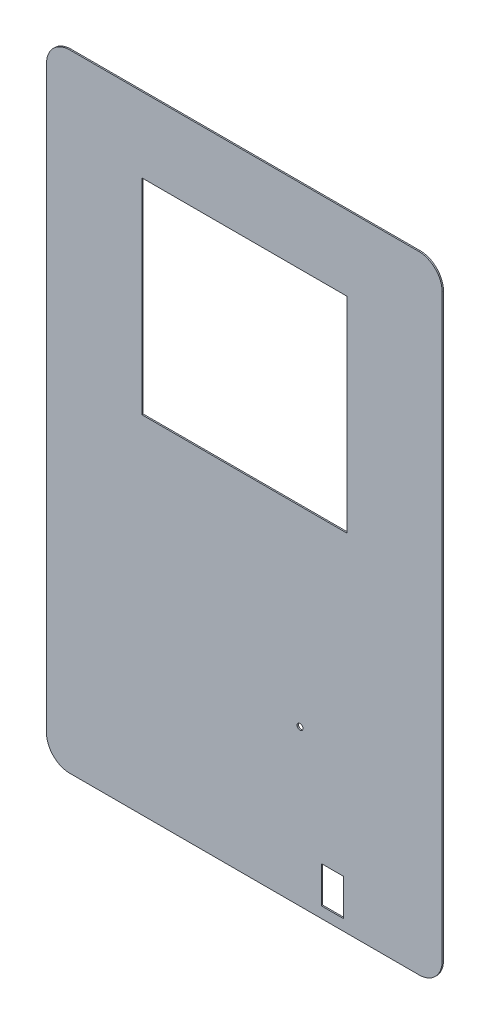
ISO-10303-21;
HEADER;
FILE_DESCRIPTION(('STEP AP214'),'2;1');
FILE_NAME('part.step','',(''),(''),'','','');
FILE_SCHEMA(('AUTOMOTIVE_DESIGN { 1 0 10303 214 1 1 1 1 }'));
ENDSEC;
DATA;
#1=APPLICATION_CONTEXT('core data for automotive mechanical design processes');
#2=APPLICATION_PROTOCOL_DEFINITION('international standard','automotive_design',2000,#1);
#3=PRODUCT_CONTEXT('',#1,'mechanical');
#4=PRODUCT('Part','Part','',(#3));
#5=PRODUCT_RELATED_PRODUCT_CATEGORY('part','',(#4));
#6=PRODUCT_DEFINITION_FORMATION('','',#4);
#7=PRODUCT_DEFINITION_CONTEXT('part definition',#1,'design');
#8=PRODUCT_DEFINITION('design','',#6,#7);
#9=PRODUCT_DEFINITION_SHAPE('','',#8);
#10=(LENGTH_UNIT() NAMED_UNIT(*) SI_UNIT(.MILLI.,.METRE.));
#11=(NAMED_UNIT(*) PLANE_ANGLE_UNIT() SI_UNIT($,.RADIAN.));
#12=(NAMED_UNIT(*) SI_UNIT($,.STERADIAN.) SOLID_ANGLE_UNIT());
#13=UNCERTAINTY_MEASURE_WITH_UNIT(LENGTH_MEASURE(1.E-05),#10,'distance_accuracy_value','');
#14=(GEOMETRIC_REPRESENTATION_CONTEXT(3) GLOBAL_UNCERTAINTY_ASSIGNED_CONTEXT((#13)) GLOBAL_UNIT_ASSIGNED_CONTEXT((#10,
#11,#12)) REPRESENTATION_CONTEXT('',''));
#15=CARTESIAN_POINT('',(0.,0.,0.));
#16=DIRECTION('',(0.,0.,1.));
#17=DIRECTION('',(1.,0.,0.));
#18=AXIS2_PLACEMENT_3D('',#15,#16,#17);
#19=CARTESIAN_POINT('',(-23.82,-39.57,0.18));
#20=DIRECTION('',(0.,0.,-1.));
#21=DIRECTION('',(-1.,0.,0.));
#22=AXIS2_PLACEMENT_3D('',#19,#20,#21);
#23=CYLINDRICAL_SURFACE('',#22,3.18);
#24=CARTESIAN_POINT('',(-23.82,-39.57,0.));
#25=DIRECTION('',(0.,0.,1.));
#26=DIRECTION('',(-1.,0.,0.));
#27=AXIS2_PLACEMENT_3D('',#24,#25,#26);
#28=CIRCLE('',#27,3.18);
#29=CARTESIAN_POINT('',(-27.,-39.57,0.));
#30=VERTEX_POINT('',#29);
#31=CARTESIAN_POINT('',(-23.82,-42.75,0.));
#32=VERTEX_POINT('',#31);
#33=EDGE_CURVE('E218',#30,#32,#28,.T.);
#34=ORIENTED_EDGE('',*,*,#33,.T.);
#35=DIRECTION('',(0.,0.,-1.));
#36=VECTOR('',#35,1.);
#37=CARTESIAN_POINT('',(-23.82,-42.75,0.18));
#38=LINE('',#37,#36);
#39=CARTESIAN_POINT('',(-23.82,-42.75,0.18));
#40=VERTEX_POINT('',#39);
#41=EDGE_CURVE('E11',#40,#32,#38,.T.);
#42=ORIENTED_EDGE('',*,*,#41,.F.);
#43=CARTESIAN_POINT('',(-23.82,-39.57,0.18));
#44=DIRECTION('',(0.,0.,1.));
#45=DIRECTION('',(-1.,0.,0.));
#46=AXIS2_PLACEMENT_3D('',#43,#44,#45);
#47=CIRCLE('',#46,3.18);
#48=CARTESIAN_POINT('',(-27.,-39.57,0.18));
#49=VERTEX_POINT('',#48);
#50=EDGE_CURVE('E223',#49,#40,#47,.T.);
#51=ORIENTED_EDGE('',*,*,#50,.F.);
#52=DIRECTION('',(0.,0.,-1.));
#53=VECTOR('',#52,1.);
#54=CARTESIAN_POINT('',(-27.,-39.57,0.18));
#55=LINE('',#54,#53);
#56=EDGE_CURVE('E241',#49,#30,#55,.T.);
#57=ORIENTED_EDGE('',*,*,#56,.T.);
#58=EDGE_LOOP('',(#34,#42,#51,#57));
#59=FACE_BOUND('',#58,.T.);
#60=ADVANCED_FACE('F36',(#59),#23,.T.);
#61=CARTESIAN_POINT('',(-23.82,-42.75,0.18));
#62=DIRECTION('',(0.,1.,0.));
#63=DIRECTION('',(0.,0.,1.));
#64=AXIS2_PLACEMENT_3D('',#61,#62,#63);
#65=PLANE('',#64);
#66=DIRECTION('',(1.,0.,0.));
#67=VECTOR('',#66,1.);
#68=CARTESIAN_POINT('',(-23.82,-42.75,0.));
#69=LINE('',#68,#67);
#70=CARTESIAN_POINT('',(23.82,-42.75,0.));
#71=VERTEX_POINT('',#70);
#72=EDGE_CURVE('E244',#32,#71,#69,.T.);
#73=ORIENTED_EDGE('',*,*,#72,.T.);
#74=DIRECTION('',(0.,0.,-1.));
#75=VECTOR('',#74,1.);
#76=CARTESIAN_POINT('',(23.82,-42.75,0.18));
#77=LINE('',#76,#75);
#78=CARTESIAN_POINT('',(23.82,-42.75,0.18));
#79=VERTEX_POINT('',#78);
#80=EDGE_CURVE('E43',#79,#71,#77,.T.);
#81=ORIENTED_EDGE('',*,*,#80,.F.);
#82=DIRECTION('',(1.,0.,0.));
#83=VECTOR('',#82,1.);
#84=CARTESIAN_POINT('',(-23.82,-42.75,0.18));
#85=LINE('',#84,#83);
#86=EDGE_CURVE('E226',#40,#79,#85,.T.);
#87=ORIENTED_EDGE('',*,*,#86,.F.);
#88=ORIENTED_EDGE('',*,*,#41,.T.);
#89=EDGE_LOOP('',(#73,#81,#87,#88));
#90=FACE_BOUND('',#89,.T.);
#91=ADVANCED_FACE('F300',(#90),#65,.F.);
#92=CARTESIAN_POINT('',(23.82,-39.57,0.18));
#93=DIRECTION('',(0.,0.,-1.));
#94=DIRECTION('',(-1.,0.,0.));
#95=AXIS2_PLACEMENT_3D('',#92,#93,#94);
#96=CYLINDRICAL_SURFACE('',#95,3.18);
#97=CARTESIAN_POINT('',(23.82,-39.57,0.));
#98=DIRECTION('',(0.,0.,1.));
#99=DIRECTION('',(1.,0.,0.));
#100=AXIS2_PLACEMENT_3D('',#97,#98,#99);
#101=CIRCLE('',#100,3.18);
#102=CARTESIAN_POINT('',(27.,-39.57,0.));
#103=VERTEX_POINT('',#102);
#104=EDGE_CURVE('E246',#71,#103,#101,.T.);
#105=ORIENTED_EDGE('',*,*,#104,.T.);
#106=DIRECTION('',(0.,0.,-1.));
#107=VECTOR('',#106,1.);
#108=CARTESIAN_POINT('',(27.,-39.57,0.18));
#109=LINE('',#108,#107);
#110=CARTESIAN_POINT('',(27.,-39.57,0.18));
#111=VERTEX_POINT('',#110);
#112=EDGE_CURVE('E271',#111,#103,#109,.T.);
#113=ORIENTED_EDGE('',*,*,#112,.F.);
#114=CARTESIAN_POINT('',(23.82,-39.57,0.18));
#115=DIRECTION('',(0.,0.,1.));
#116=DIRECTION('',(1.,0.,0.));
#117=AXIS2_PLACEMENT_3D('',#114,#115,#116);
#118=CIRCLE('',#117,3.18);
#119=EDGE_CURVE('E229',#79,#111,#118,.T.);
#120=ORIENTED_EDGE('',*,*,#119,.F.);
#121=ORIENTED_EDGE('',*,*,#80,.T.);
#122=EDGE_LOOP('',(#105,#113,#120,#121));
#123=FACE_BOUND('',#122,.T.);
#124=ADVANCED_FACE('F278',(#123),#96,.T.);
#125=CARTESIAN_POINT('',(27.,-39.57,0.18));
#126=DIRECTION('',(-1.,0.,0.));
#127=DIRECTION('',(0.,0.,1.));
#128=AXIS2_PLACEMENT_3D('',#125,#126,#127);
#129=PLANE('',#128);
#130=DIRECTION('',(0.,1.,0.));
#131=VECTOR('',#130,1.);
#132=CARTESIAN_POINT('',(27.,-39.57,0.));
#133=LINE('',#132,#131);
#134=CARTESIAN_POINT('',(27.,39.57,0.));
#135=VERTEX_POINT('',#134);
#136=EDGE_CURVE('E248',#103,#135,#133,.T.);
#137=ORIENTED_EDGE('',*,*,#136,.T.);
#138=DIRECTION('',(0.,0.,-1.));
#139=VECTOR('',#138,1.);
#140=CARTESIAN_POINT('',(27.,39.57,0.18));
#141=LINE('',#140,#139);
#142=CARTESIAN_POINT('',(27.,39.57,0.18));
#143=VERTEX_POINT('',#142);
#144=EDGE_CURVE('E268',#143,#135,#141,.T.);
#145=ORIENTED_EDGE('',*,*,#144,.F.);
#146=DIRECTION('',(0.,1.,0.));
#147=VECTOR('',#146,1.);
#148=CARTESIAN_POINT('',(27.,-39.57,0.18));
#149=LINE('',#148,#147);
#150=EDGE_CURVE('E231',#111,#143,#149,.T.);
#151=ORIENTED_EDGE('',*,*,#150,.F.);
#152=ORIENTED_EDGE('',*,*,#112,.T.);
#153=EDGE_LOOP('',(#137,#145,#151,#152));
#154=FACE_BOUND('',#153,.T.);
#155=ADVANCED_FACE('F288',(#154),#129,.F.);
#156=CARTESIAN_POINT('',(23.82,39.57,0.18));
#157=DIRECTION('',(0.,0.,-1.));
#158=DIRECTION('',(-1.,0.,0.));
#159=AXIS2_PLACEMENT_3D('',#156,#157,#158);
#160=CYLINDRICAL_SURFACE('',#159,3.18);
#161=CARTESIAN_POINT('',(23.82,39.57,0.));
#162=DIRECTION('',(0.,0.,1.));
#163=DIRECTION('',(-1.,0.,0.));
#164=AXIS2_PLACEMENT_3D('',#161,#162,#163);
#165=CIRCLE('',#164,3.18);
#166=CARTESIAN_POINT('',(23.82,42.75,0.));
#167=VERTEX_POINT('',#166);
#168=EDGE_CURVE('E250',#135,#167,#165,.T.);
#169=ORIENTED_EDGE('',*,*,#168,.T.);
#170=DIRECTION('',(0.,0.,-1.));
#171=VECTOR('',#170,1.);
#172=CARTESIAN_POINT('',(23.82,42.75,0.18));
#173=LINE('',#172,#171);
#174=CARTESIAN_POINT('',(23.82,42.75,0.18));
#175=VERTEX_POINT('',#174);
#176=EDGE_CURVE('E265',#175,#167,#173,.T.);
#177=ORIENTED_EDGE('',*,*,#176,.F.);
#178=CARTESIAN_POINT('',(23.82,39.57,0.18));
#179=DIRECTION('',(0.,0.,1.));
#180=DIRECTION('',(-1.,0.,0.));
#181=AXIS2_PLACEMENT_3D('',#178,#179,#180);
#182=CIRCLE('',#181,3.18);
#183=EDGE_CURVE('E233',#143,#175,#182,.T.);
#184=ORIENTED_EDGE('',*,*,#183,.F.);
#185=ORIENTED_EDGE('',*,*,#144,.T.);
#186=EDGE_LOOP('',(#169,#177,#184,#185));
#187=FACE_BOUND('',#186,.T.);
#188=ADVANCED_FACE('F292',(#187),#160,.T.);
#189=CARTESIAN_POINT('',(-23.82,42.75,0.18));
#190=DIRECTION('',(0.,-1.,0.));
#191=DIRECTION('',(0.,0.,-1.));
#192=AXIS2_PLACEMENT_3D('',#189,#190,#191);
#193=PLANE('',#192);
#194=DIRECTION('',(-1.,0.,0.));
#195=VECTOR('',#194,1.);
#196=CARTESIAN_POINT('',(-23.82,42.75,0.));
#197=LINE('',#196,#195);
#198=CARTESIAN_POINT('',(-23.82,42.75,0.));
#199=VERTEX_POINT('',#198);
#200=EDGE_CURVE('E252',#167,#199,#197,.T.);
#201=ORIENTED_EDGE('',*,*,#200,.T.);
#202=DIRECTION('',(0.,0.,-1.));
#203=VECTOR('',#202,1.);
#204=CARTESIAN_POINT('',(-23.82,42.75,0.18));
#205=LINE('',#204,#203);
#206=CARTESIAN_POINT('',(-23.82,42.75,0.18));
#207=VERTEX_POINT('',#206);
#208=EDGE_CURVE('E262',#207,#199,#205,.T.);
#209=ORIENTED_EDGE('',*,*,#208,.F.);
#210=DIRECTION('',(-1.,0.,0.));
#211=VECTOR('',#210,1.);
#212=CARTESIAN_POINT('',(-23.82,42.75,0.18));
#213=LINE('',#212,#211);
#214=EDGE_CURVE('E235',#175,#207,#213,.T.);
#215=ORIENTED_EDGE('',*,*,#214,.F.);
#216=ORIENTED_EDGE('',*,*,#176,.T.);
#217=EDGE_LOOP('',(#201,#209,#215,#216));
#218=FACE_BOUND('',#217,.T.);
#219=ADVANCED_FACE('F313',(#218),#193,.F.);
#220=CARTESIAN_POINT('',(-23.82,39.57,0.18));
#221=DIRECTION('',(0.,0.,-1.));
#222=DIRECTION('',(-1.,0.,0.));
#223=AXIS2_PLACEMENT_3D('',#220,#221,#222);
#224=CYLINDRICAL_SURFACE('',#223,3.18);
#225=CARTESIAN_POINT('',(-23.82,39.57,0.));
#226=DIRECTION('',(0.,0.,1.));
#227=DIRECTION('',(-1.,0.,0.));
#228=AXIS2_PLACEMENT_3D('',#225,#226,#227);
#229=CIRCLE('',#228,3.18);
#230=CARTESIAN_POINT('',(-27.,39.57,0.));
#231=VERTEX_POINT('',#230);
#232=EDGE_CURVE('E254',#199,#231,#229,.T.);
#233=ORIENTED_EDGE('',*,*,#232,.T.);
#234=DIRECTION('',(0.,0.,-1.));
#235=VECTOR('',#234,1.);
#236=CARTESIAN_POINT('',(-27.,39.57,0.18));
#237=LINE('',#236,#235);
#238=CARTESIAN_POINT('',(-27.,39.57,0.18));
#239=VERTEX_POINT('',#238);
#240=EDGE_CURVE('E259',#239,#231,#237,.T.);
#241=ORIENTED_EDGE('',*,*,#240,.F.);
#242=CARTESIAN_POINT('',(-23.82,39.57,0.18));
#243=DIRECTION('',(0.,0.,1.));
#244=DIRECTION('',(-1.,0.,0.));
#245=AXIS2_PLACEMENT_3D('',#242,#243,#244);
#246=CIRCLE('',#245,3.18);
#247=EDGE_CURVE('E237',#207,#239,#246,.T.);
#248=ORIENTED_EDGE('',*,*,#247,.F.);
#249=ORIENTED_EDGE('',*,*,#208,.T.);
#250=EDGE_LOOP('',(#233,#241,#248,#249));
#251=FACE_BOUND('',#250,.T.);
#252=ADVANCED_FACE('F311',(#251),#224,.T.);
#253=CARTESIAN_POINT('',(-27.,-39.57,0.18));
#254=DIRECTION('',(1.,0.,0.));
#255=DIRECTION('',(0.,0.,-1.));
#256=AXIS2_PLACEMENT_3D('',#253,#254,#255);
#257=PLANE('',#256);
#258=DIRECTION('',(0.,-1.,0.));
#259=VECTOR('',#258,1.);
#260=CARTESIAN_POINT('',(-27.,-39.57,0.));
#261=LINE('',#260,#259);
#262=EDGE_CURVE('E227',#231,#30,#261,.T.);
#263=ORIENTED_EDGE('',*,*,#262,.T.);
#264=ORIENTED_EDGE('',*,*,#56,.F.);
#265=DIRECTION('',(0.,-1.,0.));
#266=VECTOR('',#265,1.);
#267=CARTESIAN_POINT('',(-27.,-39.57,0.18));
#268=LINE('',#267,#266);
#269=EDGE_CURVE('E239',#239,#49,#268,.T.);
#270=ORIENTED_EDGE('',*,*,#269,.F.);
#271=ORIENTED_EDGE('',*,*,#240,.T.);
#272=EDGE_LOOP('',(#263,#264,#270,#271));
#273=FACE_BOUND('',#272,.T.);
#274=ADVANCED_FACE('F306',(#273),#257,.F.);
#275=CARTESIAN_POINT('',(-23.82,-39.57,0.18));
#276=DIRECTION('',(0.,0.,-1.));
#277=DIRECTION('',(-1.,0.,0.));
#278=AXIS2_PLACEMENT_3D('',#275,#276,#277);
#279=PLANE('',#278);
#280=DIRECTION('',(-1.,0.,0.));
#281=VECTOR('',#280,1.);
#282=CARTESIAN_POINT('',(-14.,32.55,0.18));
#283=LINE('',#282,#281);
#284=CARTESIAN_POINT('',(14.,32.55,0.18));
#285=VERTEX_POINT('',#284);
#286=CARTESIAN_POINT('',(-14.,32.55,0.18));
#287=VERTEX_POINT('',#286);
#288=EDGE_CURVE('E175',#285,#287,#283,.T.);
#289=ORIENTED_EDGE('',*,*,#288,.F.);
#290=DIRECTION('',(0.,1.,0.));
#291=VECTOR('',#290,1.);
#292=CARTESIAN_POINT('',(14.,32.55,0.18));
#293=LINE('',#292,#291);
#294=CARTESIAN_POINT('',(14.,4.55,0.18));
#295=VERTEX_POINT('',#294);
#296=EDGE_CURVE('E50',#295,#285,#293,.T.);
#297=ORIENTED_EDGE('',*,*,#296,.F.);
#298=DIRECTION('',(1.,0.,0.));
#299=VECTOR('',#298,1.);
#300=CARTESIAN_POINT('',(-14.,4.55,0.18));
#301=LINE('',#300,#299);
#302=CARTESIAN_POINT('',(-14.,4.55,0.18));
#303=VERTEX_POINT('',#302);
#304=EDGE_CURVE('E166',#303,#295,#301,.T.);
#305=ORIENTED_EDGE('',*,*,#304,.F.);
#306=DIRECTION('',(0.,-1.,0.));
#307=VECTOR('',#306,1.);
#308=CARTESIAN_POINT('',(-14.,32.55,0.18));
#309=LINE('',#308,#307);
#310=EDGE_CURVE('E169',#287,#303,#309,.T.);
#311=ORIENTED_EDGE('',*,*,#310,.F.);
#312=EDGE_LOOP('',(#289,#297,#305,#311));
#313=FACE_BOUND('',#312,.T.);
#314=DIRECTION('',(-1.,0.,0.));
#315=VECTOR('',#314,1.);
#316=CARTESIAN_POINT('',(10.5,-36.25,0.18));
#317=LINE('',#316,#315);
#318=CARTESIAN_POINT('',(13.5,-36.25,0.18));
#319=VERTEX_POINT('',#318);
#320=CARTESIAN_POINT('',(10.5,-36.25,0.18));
#321=VERTEX_POINT('',#320);
#322=EDGE_CURVE('E197',#319,#321,#317,.T.);
#323=ORIENTED_EDGE('',*,*,#322,.F.);
#324=DIRECTION('',(0.,1.,0.));
#325=VECTOR('',#324,1.);
#326=CARTESIAN_POINT('',(13.5,-41.25,0.18));
#327=LINE('',#326,#325);
#328=CARTESIAN_POINT('',(13.5,-41.25,0.18));
#329=VERTEX_POINT('',#328);
#330=EDGE_CURVE('E195',#329,#319,#327,.T.);
#331=ORIENTED_EDGE('',*,*,#330,.F.);
#332=DIRECTION('',(1.,0.,0.));
#333=VECTOR('',#332,1.);
#334=CARTESIAN_POINT('',(10.5,-41.25,0.18));
#335=LINE('',#334,#333);
#336=CARTESIAN_POINT('',(10.5,-41.25,0.18));
#337=VERTEX_POINT('',#336);
#338=EDGE_CURVE('E203',#337,#329,#335,.T.);
#339=ORIENTED_EDGE('',*,*,#338,.F.);
#340=DIRECTION('',(0.,-1.,0.));
#341=VECTOR('',#340,1.);
#342=CARTESIAN_POINT('',(10.5,-41.25,0.18));
#343=LINE('',#342,#341);
#344=EDGE_CURVE('E200',#321,#337,#343,.T.);
#345=ORIENTED_EDGE('',*,*,#344,.F.);
#346=EDGE_LOOP('',(#323,#331,#339,#345));
#347=FACE_BOUND('',#346,.T.);
#348=CARTESIAN_POINT('',(7.60000000000001,-21.55,0.18));
#349=DIRECTION('',(0.,0.,1.));
#350=DIRECTION('',(1.,0.,0.));
#351=AXIS2_PLACEMENT_3D('',#348,#349,#350);
#352=CIRCLE('',#351,0.4);
#353=CARTESIAN_POINT('',(8.00000000000001,-21.55,0.18));
#354=VERTEX_POINT('',#353);
#355=EDGE_CURVE('E189',#354,#354,#352,.T.);
#356=ORIENTED_EDGE('',*,*,#355,.F.);
#357=EDGE_LOOP('',(#356));
#358=FACE_BOUND('',#357,.T.);
#359=ORIENTED_EDGE('',*,*,#50,.T.);
#360=ORIENTED_EDGE('',*,*,#86,.T.);
#361=ORIENTED_EDGE('',*,*,#119,.T.);
#362=ORIENTED_EDGE('',*,*,#150,.T.);
#363=ORIENTED_EDGE('',*,*,#183,.T.);
#364=ORIENTED_EDGE('',*,*,#214,.T.);
#365=ORIENTED_EDGE('',*,*,#247,.T.);
#366=ORIENTED_EDGE('',*,*,#269,.T.);
#367=EDGE_LOOP('',(#359,#360,#361,#362,#363,#364,#365,#366));
#368=FACE_BOUND('',#367,.T.);
#369=ADVANCED_FACE('F296',(#313,#347,#358,#368),#279,.F.);
#370=CARTESIAN_POINT('',(-23.82,-39.57,0.));
#371=DIRECTION('',(0.,0.,-1.));
#372=DIRECTION('',(-1.,0.,0.));
#373=AXIS2_PLACEMENT_3D('',#370,#371,#372);
#374=PLANE('',#373);
#375=DIRECTION('',(0.,1.,0.));
#376=VECTOR('',#375,1.);
#377=CARTESIAN_POINT('',(14.,32.55,0.));
#378=LINE('',#377,#376);
#379=CARTESIAN_POINT('',(14.,4.55,0.));
#380=VERTEX_POINT('',#379);
#381=CARTESIAN_POINT('',(14.,32.55,0.));
#382=VERTEX_POINT('',#381);
#383=EDGE_CURVE('E150',#380,#382,#378,.T.);
#384=ORIENTED_EDGE('',*,*,#383,.T.);
#385=DIRECTION('',(-1.,0.,0.));
#386=VECTOR('',#385,1.);
#387=CARTESIAN_POINT('',(-14.,32.55,0.));
#388=LINE('',#387,#386);
#389=CARTESIAN_POINT('',(-14.,32.55,0.));
#390=VERTEX_POINT('',#389);
#391=EDGE_CURVE('E159',#382,#390,#388,.T.);
#392=ORIENTED_EDGE('',*,*,#391,.T.);
#393=DIRECTION('',(0.,-1.,0.));
#394=VECTOR('',#393,1.);
#395=CARTESIAN_POINT('',(-14.,32.55,0.));
#396=LINE('',#395,#394);
#397=CARTESIAN_POINT('',(-14.,4.55,0.));
#398=VERTEX_POINT('',#397);
#399=EDGE_CURVE('E58',#390,#398,#396,.T.);
#400=ORIENTED_EDGE('',*,*,#399,.T.);
#401=DIRECTION('',(1.,0.,0.));
#402=VECTOR('',#401,1.);
#403=CARTESIAN_POINT('',(-14.,4.55,0.));
#404=LINE('',#403,#402);
#405=EDGE_CURVE('E156',#398,#380,#404,.T.);
#406=ORIENTED_EDGE('',*,*,#405,.T.);
#407=EDGE_LOOP('',(#384,#392,#400,#406));
#408=FACE_BOUND('',#407,.T.);
#409=DIRECTION('',(0.,1.,0.));
#410=VECTOR('',#409,1.);
#411=CARTESIAN_POINT('',(13.5,-41.25,0.));
#412=LINE('',#411,#410);
#413=CARTESIAN_POINT('',(13.5,-41.25,0.));
#414=VERTEX_POINT('',#413);
#415=CARTESIAN_POINT('',(13.5,-36.25,0.));
#416=VERTEX_POINT('',#415);
#417=EDGE_CURVE('E192',#414,#416,#412,.T.);
#418=ORIENTED_EDGE('',*,*,#417,.T.);
#419=DIRECTION('',(-1.,0.,0.));
#420=VECTOR('',#419,1.);
#421=CARTESIAN_POINT('',(10.5,-36.25,0.));
#422=LINE('',#421,#420);
#423=CARTESIAN_POINT('',(10.5,-36.25,0.));
#424=VERTEX_POINT('',#423);
#425=EDGE_CURVE('E209',#416,#424,#422,.T.);
#426=ORIENTED_EDGE('',*,*,#425,.T.);
#427=DIRECTION('',(0.,-1.,0.));
#428=VECTOR('',#427,1.);
#429=CARTESIAN_POINT('',(10.5,-41.25,0.));
#430=LINE('',#429,#428);
#431=CARTESIAN_POINT('',(10.5,-41.25,0.));
#432=VERTEX_POINT('',#431);
#433=EDGE_CURVE('E185',#424,#432,#430,.T.);
#434=ORIENTED_EDGE('',*,*,#433,.T.);
#435=DIRECTION('',(1.,0.,0.));
#436=VECTOR('',#435,1.);
#437=CARTESIAN_POINT('',(10.5,-41.25,0.));
#438=LINE('',#437,#436);
#439=EDGE_CURVE('E188',#432,#414,#438,.T.);
#440=ORIENTED_EDGE('',*,*,#439,.T.);
#441=EDGE_LOOP('',(#418,#426,#434,#440));
#442=FACE_BOUND('',#441,.T.);
#443=CARTESIAN_POINT('',(7.60000000000001,-21.55,0.));
#444=DIRECTION('',(0.,0.,-1.));
#445=DIRECTION('',(-1.,0.,0.));
#446=AXIS2_PLACEMENT_3D('',#443,#444,#445);
#447=CIRCLE('',#446,0.4);
#448=CARTESIAN_POINT('',(7.20000000000001,-21.55,0.));
#449=VERTEX_POINT('',#448);
#450=EDGE_CURVE('E181',#449,#449,#447,.F.);
#451=ORIENTED_EDGE('',*,*,#450,.T.);
#452=EDGE_LOOP('',(#451));
#453=FACE_BOUND('',#452,.T.);
#454=ORIENTED_EDGE('',*,*,#33,.F.);
#455=ORIENTED_EDGE('',*,*,#262,.F.);
#456=ORIENTED_EDGE('',*,*,#232,.F.);
#457=ORIENTED_EDGE('',*,*,#200,.F.);
#458=ORIENTED_EDGE('',*,*,#168,.F.);
#459=ORIENTED_EDGE('',*,*,#136,.F.);
#460=ORIENTED_EDGE('',*,*,#104,.F.);
#461=ORIENTED_EDGE('',*,*,#72,.F.);
#462=EDGE_LOOP('',(#454,#455,#456,#457,#458,#459,#460,#461));
#463=FACE_BOUND('',#462,.T.);
#464=ADVANCED_FACE('F163',(#408,#442,#453,#463),#374,.T.);
#465=CARTESIAN_POINT('',(7.60000000000001,-21.55,-0.000999999999999997));
#466=DIRECTION('',(0.,0.,1.));
#467=DIRECTION('',(1.,0.,0.));
#468=AXIS2_PLACEMENT_3D('',#465,#466,#467);
#469=CYLINDRICAL_SURFACE('',#468,0.4);
#470=ORIENTED_EDGE('',*,*,#450,.F.);
#471=EDGE_LOOP('',(#470));
#472=FACE_BOUND('',#471,.T.);
#473=ORIENTED_EDGE('',*,*,#355,.T.);
#474=EDGE_LOOP('',(#473));
#475=FACE_BOUND('',#474,.T.);
#476=ADVANCED_FACE('F365',(#472,#475),#469,.F.);
#477=CARTESIAN_POINT('',(13.5,-41.25,-0.000999999999999997));
#478=DIRECTION('',(1.,0.,0.));
#479=DIRECTION('',(0.,0.,-1.));
#480=AXIS2_PLACEMENT_3D('',#477,#478,#479);
#481=PLANE('',#480);
#482=DIRECTION('',(0.,0.,1.));
#483=VECTOR('',#482,1.);
#484=CARTESIAN_POINT('',(13.5,-41.25,-0.000999999999999997));
#485=LINE('',#484,#483);
#486=EDGE_CURVE('E207',#414,#329,#485,.T.);
#487=ORIENTED_EDGE('',*,*,#486,.T.);
#488=ORIENTED_EDGE('',*,*,#330,.T.);
#489=DIRECTION('',(0.,0.,1.));
#490=VECTOR('',#489,1.);
#491=CARTESIAN_POINT('',(13.5,-36.25,-0.000999999999999997));
#492=LINE('',#491,#490);
#493=EDGE_CURVE('E206',#416,#319,#492,.T.);
#494=ORIENTED_EDGE('',*,*,#493,.F.);
#495=ORIENTED_EDGE('',*,*,#417,.F.);
#496=EDGE_LOOP('',(#487,#488,#494,#495));
#497=FACE_BOUND('',#496,.T.);
#498=ADVANCED_FACE('F370',(#497),#481,.F.);
#499=CARTESIAN_POINT('',(10.5,-41.25,-0.000999999999999997));
#500=DIRECTION('',(0.,-1.,0.));
#501=DIRECTION('',(0.,0.,-1.));
#502=AXIS2_PLACEMENT_3D('',#499,#500,#501);
#503=PLANE('',#502);
#504=DIRECTION('',(0.,0.,1.));
#505=VECTOR('',#504,1.);
#506=CARTESIAN_POINT('',(10.5,-41.25,-0.000999999999999997));
#507=LINE('',#506,#505);
#508=EDGE_CURVE('E210',#432,#337,#507,.T.);
#509=ORIENTED_EDGE('',*,*,#508,.T.);
#510=ORIENTED_EDGE('',*,*,#338,.T.);
#511=ORIENTED_EDGE('',*,*,#486,.F.);
#512=ORIENTED_EDGE('',*,*,#439,.F.);
#513=EDGE_LOOP('',(#509,#510,#511,#512));
#514=FACE_BOUND('',#513,.T.);
#515=ADVANCED_FACE('F382',(#514),#503,.F.);
#516=CARTESIAN_POINT('',(10.5,-41.25,-0.000999999999999997));
#517=DIRECTION('',(-1.,0.,0.));
#518=DIRECTION('',(0.,0.,1.));
#519=AXIS2_PLACEMENT_3D('',#516,#517,#518);
#520=PLANE('',#519);
#521=DIRECTION('',(0.,0.,1.));
#522=VECTOR('',#521,1.);
#523=CARTESIAN_POINT('',(10.5,-36.25,-0.000999999999999997));
#524=LINE('',#523,#522);
#525=EDGE_CURVE('E212',#424,#321,#524,.T.);
#526=ORIENTED_EDGE('',*,*,#525,.T.);
#527=ORIENTED_EDGE('',*,*,#344,.T.);
#528=ORIENTED_EDGE('',*,*,#508,.F.);
#529=ORIENTED_EDGE('',*,*,#433,.F.);
#530=EDGE_LOOP('',(#526,#527,#528,#529));
#531=FACE_BOUND('',#530,.T.);
#532=ADVANCED_FACE('F392',(#531),#520,.F.);
#533=CARTESIAN_POINT('',(10.5,-36.25,-0.000999999999999997));
#534=DIRECTION('',(0.,1.,0.));
#535=DIRECTION('',(0.,0.,1.));
#536=AXIS2_PLACEMENT_3D('',#533,#534,#535);
#537=PLANE('',#536);
#538=ORIENTED_EDGE('',*,*,#493,.T.);
#539=ORIENTED_EDGE('',*,*,#322,.T.);
#540=ORIENTED_EDGE('',*,*,#525,.F.);
#541=ORIENTED_EDGE('',*,*,#425,.F.);
#542=EDGE_LOOP('',(#538,#539,#540,#541));
#543=FACE_BOUND('',#542,.T.);
#544=ADVANCED_FACE('F402',(#543),#537,.F.);
#545=CARTESIAN_POINT('',(14.,32.55,0.));
#546=DIRECTION('',(1.,0.,0.));
#547=DIRECTION('',(0.,1.,0.));
#548=AXIS2_PLACEMENT_3D('',#545,#546,#547);
#549=PLANE('',#548);
#550=ORIENTED_EDGE('',*,*,#296,.T.);
#551=DIRECTION('',(0.,0.,1.));
#552=VECTOR('',#551,1.);
#553=CARTESIAN_POINT('',(14.,32.55,0.));
#554=LINE('',#553,#552);
#555=EDGE_CURVE('E146',#382,#285,#554,.T.);
#556=ORIENTED_EDGE('',*,*,#555,.F.);
#557=ORIENTED_EDGE('',*,*,#383,.F.);
#558=DIRECTION('',(0.,0.,1.));
#559=VECTOR('',#558,1.);
#560=CARTESIAN_POINT('',(14.,4.55,0.));
#561=LINE('',#560,#559);
#562=EDGE_CURVE('E179',#380,#295,#561,.T.);
#563=ORIENTED_EDGE('',*,*,#562,.T.);
#564=EDGE_LOOP('',(#550,#556,#557,#563));
#565=FACE_BOUND('',#564,.T.);
#566=ADVANCED_FACE('F148',(#565),#549,.F.);
#567=CARTESIAN_POINT('',(-14.,4.55,0.));
#568=DIRECTION('',(0.,-1.,0.));
#569=DIRECTION('',(0.,0.,-1.));
#570=AXIS2_PLACEMENT_3D('',#567,#568,#569);
#571=PLANE('',#570);
#572=ORIENTED_EDGE('',*,*,#304,.T.);
#573=ORIENTED_EDGE('',*,*,#562,.F.);
#574=ORIENTED_EDGE('',*,*,#405,.F.);
#575=DIRECTION('',(0.,0.,1.));
#576=VECTOR('',#575,1.);
#577=CARTESIAN_POINT('',(-14.,4.55,0.));
#578=LINE('',#577,#576);
#579=EDGE_CURVE('E182',#398,#303,#578,.T.);
#580=ORIENTED_EDGE('',*,*,#579,.T.);
#581=EDGE_LOOP('',(#572,#573,#574,#580));
#582=FACE_BOUND('',#581,.T.);
#583=ADVANCED_FACE('F430',(#582),#571,.F.);
#584=CARTESIAN_POINT('',(-14.,32.55,0.));
#585=DIRECTION('',(-1.,0.,0.));
#586=DIRECTION('',(0.,-1.,0.));
#587=AXIS2_PLACEMENT_3D('',#584,#585,#586);
#588=PLANE('',#587);
#589=ORIENTED_EDGE('',*,*,#310,.T.);
#590=ORIENTED_EDGE('',*,*,#579,.F.);
#591=ORIENTED_EDGE('',*,*,#399,.F.);
#592=DIRECTION('',(0.,0.,1.));
#593=VECTOR('',#592,1.);
#594=CARTESIAN_POINT('',(-14.,32.55,0.));
#595=LINE('',#594,#593);
#596=EDGE_CURVE('E155',#390,#287,#595,.T.);
#597=ORIENTED_EDGE('',*,*,#596,.T.);
#598=EDGE_LOOP('',(#589,#590,#591,#597));
#599=FACE_BOUND('',#598,.T.);
#600=ADVANCED_FACE('F439',(#599),#588,.F.);
#601=CARTESIAN_POINT('',(-14.,32.55,0.));
#602=DIRECTION('',(0.,1.,0.));
#603=DIRECTION('',(-1.,0.,0.));
#604=AXIS2_PLACEMENT_3D('',#601,#602,#603);
#605=PLANE('',#604);
#606=ORIENTED_EDGE('',*,*,#288,.T.);
#607=ORIENTED_EDGE('',*,*,#596,.F.);
#608=ORIENTED_EDGE('',*,*,#391,.F.);
#609=ORIENTED_EDGE('',*,*,#555,.T.);
#610=EDGE_LOOP('',(#606,#607,#608,#609));
#611=FACE_BOUND('',#610,.T.);
#612=ADVANCED_FACE('F160',(#611),#605,.F.);
#613=CLOSED_SHELL('',(#60,#91,#124,#155,#188,#219,#252,#274,#369,#464,#476,#498,#515,#532,#544,
#566,#583,#600,#612));
#614=MANIFOLD_SOLID_BREP('B2',#613);
#615=ADVANCED_BREP_SHAPE_REPRESENTATION('',(#18,#614),#14);
#616=SHAPE_DEFINITION_REPRESENTATION(#9,#615);
ENDSEC;
END-ISO-10303-21;
